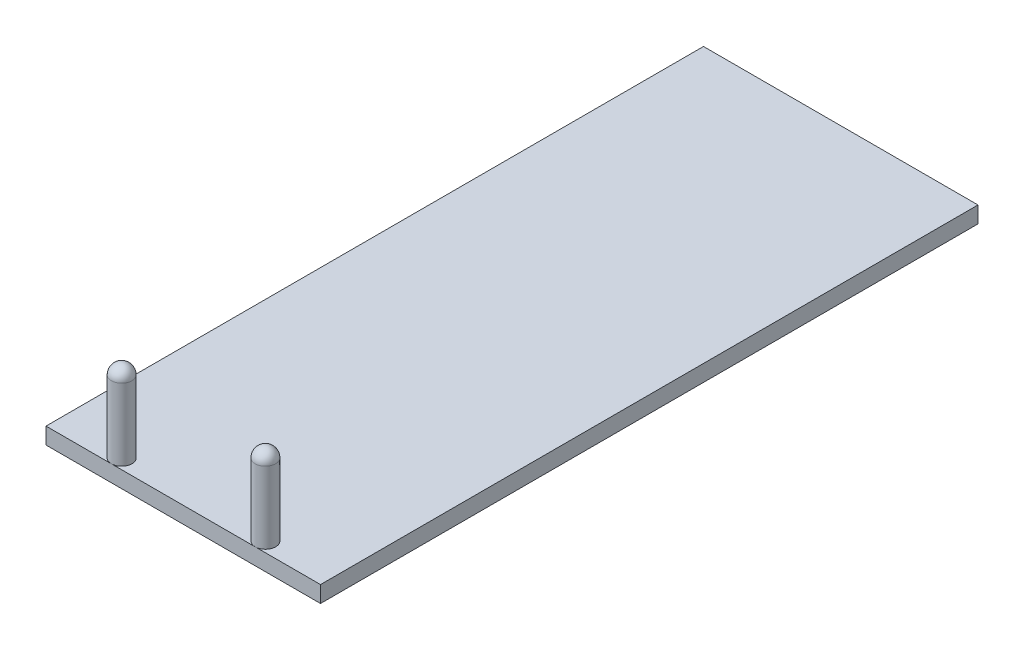
ISO-10303-21;
HEADER;
FILE_DESCRIPTION(('STEP AP214'),'2;1');
FILE_NAME('part.step','',(''),(''),'','','');
FILE_SCHEMA(('AUTOMOTIVE_DESIGN { 1 0 10303 214 1 1 1 1 }'));
ENDSEC;
DATA;
#1=APPLICATION_CONTEXT('core data for automotive mechanical design processes');
#2=APPLICATION_PROTOCOL_DEFINITION('international standard','automotive_design',2000,#1);
#3=PRODUCT_CONTEXT('',#1,'mechanical');
#4=PRODUCT('Part','Part','',(#3));
#5=PRODUCT_RELATED_PRODUCT_CATEGORY('part','',(#4));
#6=PRODUCT_DEFINITION_FORMATION('','',#4);
#7=PRODUCT_DEFINITION_CONTEXT('part definition',#1,'design');
#8=PRODUCT_DEFINITION('design','',#6,#7);
#9=PRODUCT_DEFINITION_SHAPE('','',#8);
#10=(LENGTH_UNIT() NAMED_UNIT(*) SI_UNIT(.MILLI.,.METRE.));
#11=(NAMED_UNIT(*) PLANE_ANGLE_UNIT() SI_UNIT($,.RADIAN.));
#12=(NAMED_UNIT(*) SI_UNIT($,.STERADIAN.) SOLID_ANGLE_UNIT());
#13=UNCERTAINTY_MEASURE_WITH_UNIT(LENGTH_MEASURE(1.E-05),#10,'distance_accuracy_value','');
#14=(GEOMETRIC_REPRESENTATION_CONTEXT(3) GLOBAL_UNCERTAINTY_ASSIGNED_CONTEXT((#13)) GLOBAL_UNIT_ASSIGNED_CONTEXT((#10,
#11,#12)) REPRESENTATION_CONTEXT('',''));
#15=CARTESIAN_POINT('',(0.,0.,0.));
#16=DIRECTION('',(0.,0.,1.));
#17=DIRECTION('',(1.,0.,0.));
#18=AXIS2_PLACEMENT_3D('',#15,#16,#17);
#19=CARTESIAN_POINT('',(-167.,-20.,-400.));
#20=DIRECTION('',(-1.,0.,0.));
#21=DIRECTION('',(0.,0.,1.));
#22=AXIS2_PLACEMENT_3D('',#19,#20,#21);
#23=PLANE('',#22);
#24=DIRECTION('',(0.,0.,1.));
#25=VECTOR('',#24,1.);
#26=CARTESIAN_POINT('',(-167.,0.,-400.));
#27=LINE('',#26,#25);
#28=CARTESIAN_POINT('',(-167.,0.,-400.));
#29=VERTEX_POINT('',#28);
#30=CARTESIAN_POINT('',(-167.,0.,400.));
#31=VERTEX_POINT('',#30);
#32=EDGE_CURVE('E108',#29,#31,#27,.T.);
#33=ORIENTED_EDGE('',*,*,#32,.F.);
#34=DIRECTION('',(0.,1.,0.));
#35=VECTOR('',#34,1.);
#36=CARTESIAN_POINT('',(-167.,-20.,-400.));
#37=LINE('',#36,#35);
#38=CARTESIAN_POINT('',(-167.,-20.,-400.));
#39=VERTEX_POINT('',#38);
#40=EDGE_CURVE('E67',#39,#29,#37,.T.);
#41=ORIENTED_EDGE('',*,*,#40,.F.);
#42=DIRECTION('',(0.,0.,1.));
#43=VECTOR('',#42,1.);
#44=CARTESIAN_POINT('',(-167.,-20.,-400.));
#45=LINE('',#44,#43);
#46=CARTESIAN_POINT('',(-167.,-20.,400.));
#47=VERTEX_POINT('',#46);
#48=EDGE_CURVE('E128',#39,#47,#45,.T.);
#49=ORIENTED_EDGE('',*,*,#48,.T.);
#50=DIRECTION('',(0.,1.,0.));
#51=VECTOR('',#50,1.);
#52=CARTESIAN_POINT('',(-167.,-20.,400.));
#53=LINE('',#52,#51);
#54=EDGE_CURVE('E93',#47,#31,#53,.T.);
#55=ORIENTED_EDGE('',*,*,#54,.T.);
#56=EDGE_LOOP('',(#33,#41,#49,#55));
#57=FACE_BOUND('',#56,.T.);
#58=ADVANCED_FACE('F45',(#57),#23,.T.);
#59=CARTESIAN_POINT('',(-167.,-20.,-400.));
#60=DIRECTION('',(0.,0.,-1.));
#61=DIRECTION('',(-1.,0.,0.));
#62=AXIS2_PLACEMENT_3D('',#59,#60,#61);
#63=PLANE('',#62);
#64=DIRECTION('',(-1.,0.,0.));
#65=VECTOR('',#64,1.);
#66=CARTESIAN_POINT('',(-167.,0.,-400.));
#67=LINE('',#66,#65);
#68=CARTESIAN_POINT('',(167.,0.,-400.));
#69=VERTEX_POINT('',#68);
#70=EDGE_CURVE('E125',#69,#29,#67,.T.);
#71=ORIENTED_EDGE('',*,*,#70,.F.);
#72=DIRECTION('',(0.,1.,0.));
#73=VECTOR('',#72,1.);
#74=CARTESIAN_POINT('',(167.,-20.,-400.));
#75=LINE('',#74,#73);
#76=CARTESIAN_POINT('',(167.,-20.,-400.));
#77=VERTEX_POINT('',#76);
#78=EDGE_CURVE('E131',#77,#69,#75,.T.);
#79=ORIENTED_EDGE('',*,*,#78,.F.);
#80=DIRECTION('',(-1.,0.,0.));
#81=VECTOR('',#80,1.);
#82=CARTESIAN_POINT('',(-167.,-20.,-400.));
#83=LINE('',#82,#81);
#84=EDGE_CURVE('E138',#77,#39,#83,.T.);
#85=ORIENTED_EDGE('',*,*,#84,.T.);
#86=ORIENTED_EDGE('',*,*,#40,.T.);
#87=EDGE_LOOP('',(#71,#79,#85,#86));
#88=FACE_BOUND('',#87,.T.);
#89=ADVANCED_FACE('F156',(#88),#63,.T.);
#90=CARTESIAN_POINT('',(167.,-20.,-400.));
#91=DIRECTION('',(1.,0.,0.));
#92=DIRECTION('',(0.,0.,-1.));
#93=AXIS2_PLACEMENT_3D('',#90,#91,#92);
#94=PLANE('',#93);
#95=DIRECTION('',(0.,0.,-1.));
#96=VECTOR('',#95,1.);
#97=CARTESIAN_POINT('',(167.,0.,-400.));
#98=LINE('',#97,#96);
#99=CARTESIAN_POINT('',(167.,0.,400.));
#100=VERTEX_POINT('',#99);
#101=EDGE_CURVE('E110',#100,#69,#98,.T.);
#102=ORIENTED_EDGE('',*,*,#101,.F.);
#103=DIRECTION('',(0.,1.,0.));
#104=VECTOR('',#103,1.);
#105=CARTESIAN_POINT('',(167.,-20.,400.));
#106=LINE('',#105,#104);
#107=CARTESIAN_POINT('',(167.,-20.,400.));
#108=VERTEX_POINT('',#107);
#109=EDGE_CURVE('E134',#108,#100,#106,.T.);
#110=ORIENTED_EDGE('',*,*,#109,.F.);
#111=DIRECTION('',(0.,0.,-1.));
#112=VECTOR('',#111,1.);
#113=CARTESIAN_POINT('',(167.,-20.,-400.));
#114=LINE('',#113,#112);
#115=EDGE_CURVE('E191',#108,#77,#114,.T.);
#116=ORIENTED_EDGE('',*,*,#115,.T.);
#117=ORIENTED_EDGE('',*,*,#78,.T.);
#118=EDGE_LOOP('',(#102,#110,#116,#117));
#119=FACE_BOUND('',#118,.T.);
#120=ADVANCED_FACE('F160',(#119),#94,.T.);
#121=CARTESIAN_POINT('',(-167.,-20.,400.));
#122=DIRECTION('',(0.,0.,1.));
#123=DIRECTION('',(1.,0.,0.));
#124=AXIS2_PLACEMENT_3D('',#121,#122,#123);
#125=PLANE('',#124);
#126=DIRECTION('',(1.,0.,0.));
#127=VECTOR('',#126,1.);
#128=CARTESIAN_POINT('',(-167.,0.,400.));
#129=LINE('',#128,#127);
#130=CARTESIAN_POINT('',(-87.4704065435344,0.,400.));
#131=VERTEX_POINT('',#130);
#132=EDGE_CURVE('E101',#31,#131,#129,.T.);
#133=ORIENTED_EDGE('',*,*,#132,.F.);
#134=ORIENTED_EDGE('',*,*,#54,.F.);
#135=DIRECTION('',(1.,0.,0.));
#136=VECTOR('',#135,1.);
#137=CARTESIAN_POINT('',(-167.,-20.,400.));
#138=LINE('',#137,#136);
#139=EDGE_CURVE('E188',#47,#108,#138,.T.);
#140=ORIENTED_EDGE('',*,*,#139,.T.);
#141=ORIENTED_EDGE('',*,*,#109,.T.);
#142=CARTESIAN_POINT('',(87.4704065435351,0.,400.));
#143=VERTEX_POINT('',#142);
#144=EDGE_CURVE('E113',#143,#100,#129,.T.);
#145=ORIENTED_EDGE('',*,*,#144,.F.);
#146=EDGE_CURVE('E111',#131,#143,#129,.T.);
#147=ORIENTED_EDGE('',*,*,#146,.F.);
#148=EDGE_LOOP('',(#133,#134,#140,#141,#145,#147));
#149=FACE_BOUND('',#148,.T.);
#150=ADVANCED_FACE('F115',(#149),#125,.T.);
#151=CARTESIAN_POINT('',(0.,-20.,0.));
#152=DIRECTION('',(0.,1.,0.));
#153=DIRECTION('',(0.,0.,1.));
#154=AXIS2_PLACEMENT_3D('',#151,#152,#153);
#155=PLANE('',#154);
#156=ORIENTED_EDGE('',*,*,#48,.F.);
#157=ORIENTED_EDGE('',*,*,#84,.F.);
#158=ORIENTED_EDGE('',*,*,#115,.F.);
#159=ORIENTED_EDGE('',*,*,#139,.F.);
#160=EDGE_LOOP('',(#156,#157,#158,#159));
#161=FACE_BOUND('',#160,.T.);
#162=ADVANCED_FACE('F165',(#161),#155,.F.);
#163=CARTESIAN_POINT('',(0.,0.,0.));
#164=DIRECTION('',(0.,1.,0.));
#165=DIRECTION('',(0.,0.,1.));
#166=AXIS2_PLACEMENT_3D('',#163,#164,#165);
#167=PLANE('',#166);
#168=ORIENTED_EDGE('',*,*,#146,.T.);
#169=CARTESIAN_POINT('',(87.4704065435351,0.,387.5));
#170=DIRECTION('',(0.,1.,0.));
#171=DIRECTION('',(0.,0.,1.));
#172=AXIS2_PLACEMENT_3D('',#169,#170,#171);
#173=CIRCLE('',#172,12.5);
#174=EDGE_CURVE('E59',#143,#143,#173,.T.);
#175=ORIENTED_EDGE('',*,*,#174,.F.);
#176=ORIENTED_EDGE('',*,*,#144,.T.);
#177=ORIENTED_EDGE('',*,*,#101,.T.);
#178=ORIENTED_EDGE('',*,*,#70,.T.);
#179=ORIENTED_EDGE('',*,*,#32,.T.);
#180=ORIENTED_EDGE('',*,*,#132,.T.);
#181=CARTESIAN_POINT('',(-87.4704065435344,0.,387.5));
#182=DIRECTION('',(0.,1.,0.));
#183=DIRECTION('',(0.,0.,1.));
#184=AXIS2_PLACEMENT_3D('',#181,#182,#183);
#185=CIRCLE('',#184,12.5);
#186=EDGE_CURVE('E106',#131,#131,#185,.T.);
#187=ORIENTED_EDGE('',*,*,#186,.F.);
#188=EDGE_LOOP('',(#168,#175,#176,#177,#178,#179,#180,#187));
#189=FACE_BOUND('',#188,.T.);
#190=ADVANCED_FACE('F104',(#189),#167,.T.);
#191=CARTESIAN_POINT('',(-87.4704065435344,100.,387.5));
#192=DIRECTION('',(0.,-1.,0.));
#193=DIRECTION('',(0.,0.,-1.));
#194=AXIS2_PLACEMENT_3D('',#191,#192,#193);
#195=CYLINDRICAL_SURFACE('',#194,12.5);
#196=CARTESIAN_POINT('',(-87.4704065435344,87.5,387.5));
#197=DIRECTION('',(0.,-1.,0.));
#198=DIRECTION('',(0.,0.,-1.));
#199=AXIS2_PLACEMENT_3D('',#196,#197,#198);
#200=CIRCLE('',#199,12.5);
#201=CARTESIAN_POINT('',(-87.4704065435344,87.5,375.));
#202=VERTEX_POINT('',#201);
#203=EDGE_CURVE('E11',#202,#202,#200,.T.);
#204=ORIENTED_EDGE('',*,*,#203,.T.);
#205=EDGE_LOOP('',(#204));
#206=FACE_BOUND('',#205,.T.);
#207=ORIENTED_EDGE('',*,*,#186,.T.);
#208=EDGE_LOOP('',(#207));
#209=FACE_BOUND('',#208,.T.);
#210=ADVANCED_FACE('F152',(#206,#209),#195,.T.);
#211=CARTESIAN_POINT('',(87.4704065435351,100.,387.5));
#212=DIRECTION('',(0.,-1.,0.));
#213=DIRECTION('',(0.,0.,-1.));
#214=AXIS2_PLACEMENT_3D('',#211,#212,#213);
#215=CYLINDRICAL_SURFACE('',#214,12.5);
#216=CARTESIAN_POINT('',(87.4704065435351,87.5,387.5));
#217=DIRECTION('',(0.,-1.,0.));
#218=DIRECTION('',(0.,0.,-1.));
#219=AXIS2_PLACEMENT_3D('',#216,#217,#218);
#220=CIRCLE('',#219,12.5);
#221=CARTESIAN_POINT('',(87.4704065435351,87.5,375.));
#222=VERTEX_POINT('',#221);
#223=EDGE_CURVE('E54',#222,#222,#220,.T.);
#224=ORIENTED_EDGE('',*,*,#223,.T.);
#225=EDGE_LOOP('',(#224));
#226=FACE_BOUND('',#225,.T.);
#227=ORIENTED_EDGE('',*,*,#174,.T.);
#228=EDGE_LOOP('',(#227));
#229=FACE_BOUND('',#228,.T.);
#230=ADVANCED_FACE('F143',(#226,#229),#215,.T.);
#231=CARTESIAN_POINT('',(87.4704065435351,87.5,387.5));
#232=DIRECTION('',(0.,1.,0.));
#233=DIRECTION('',(0.,0.,1.));
#234=AXIS2_PLACEMENT_3D('',#231,#232,#233);
#235=SPHERICAL_SURFACE('',#234,12.5);
#236=ORIENTED_EDGE('',*,*,#223,.F.);
#237=EDGE_LOOP('',(#236));
#238=FACE_BOUND('',#237,.T.);
#239=ADVANCED_FACE('F145',(#238),#235,.T.);
#240=CARTESIAN_POINT('',(-87.4704065435344,87.5,387.5));
#241=DIRECTION('',(0.,1.,0.));
#242=DIRECTION('',(0.,0.,1.));
#243=AXIS2_PLACEMENT_3D('',#240,#241,#242);
#244=SPHERICAL_SURFACE('',#243,12.5);
#245=ORIENTED_EDGE('',*,*,#203,.F.);
#246=EDGE_LOOP('',(#245));
#247=FACE_BOUND('',#246,.T.);
#248=ADVANCED_FACE('F47',(#247),#244,.T.);
#249=CLOSED_SHELL('',(#58,#89,#120,#150,#162,#190,#210,#230,#239,#248));
#250=MANIFOLD_SOLID_BREP('B2',#249);
#251=ADVANCED_BREP_SHAPE_REPRESENTATION('',(#18,#250),#14);
#252=SHAPE_DEFINITION_REPRESENTATION(#9,#251);
ENDSEC;
END-ISO-10303-21;
